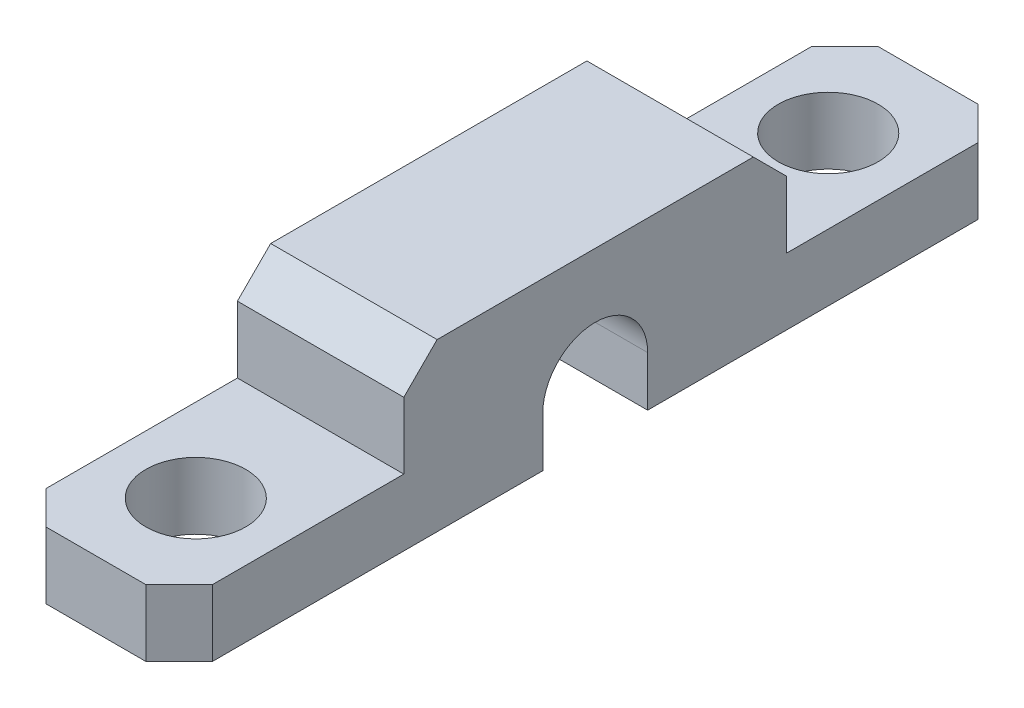
ISO-10303-21;
HEADER;
FILE_DESCRIPTION(('STEP AP214'),'2;1');
FILE_NAME('part.step','',(''),(''),'','','');
FILE_SCHEMA(('AUTOMOTIVE_DESIGN { 1 0 10303 214 1 1 1 1 }'));
ENDSEC;
DATA;
#1=APPLICATION_CONTEXT('core data for automotive mechanical design processes');
#2=APPLICATION_PROTOCOL_DEFINITION('international standard','automotive_design',2000,#1);
#3=PRODUCT_CONTEXT('',#1,'mechanical');
#4=PRODUCT('Part','Part','',(#3));
#5=PRODUCT_RELATED_PRODUCT_CATEGORY('part','',(#4));
#6=PRODUCT_DEFINITION_FORMATION('','',#4);
#7=PRODUCT_DEFINITION_CONTEXT('part definition',#1,'design');
#8=PRODUCT_DEFINITION('design','',#6,#7);
#9=PRODUCT_DEFINITION_SHAPE('','',#8);
#10=(LENGTH_UNIT() NAMED_UNIT(*) SI_UNIT(.MILLI.,.METRE.));
#11=(NAMED_UNIT(*) PLANE_ANGLE_UNIT() SI_UNIT($,.RADIAN.));
#12=(NAMED_UNIT(*) SI_UNIT($,.STERADIAN.) SOLID_ANGLE_UNIT());
#13=UNCERTAINTY_MEASURE_WITH_UNIT(LENGTH_MEASURE(1.E-05),#10,'distance_accuracy_value','');
#14=(GEOMETRIC_REPRESENTATION_CONTEXT(3) GLOBAL_UNCERTAINTY_ASSIGNED_CONTEXT((#13)) GLOBAL_UNIT_ASSIGNED_CONTEXT((#10,
#11,#12)) REPRESENTATION_CONTEXT('',''));
#15=CARTESIAN_POINT('',(0.,0.,0.));
#16=DIRECTION('',(0.,0.,1.));
#17=DIRECTION('',(1.,0.,0.));
#18=AXIS2_PLACEMENT_3D('',#15,#16,#17);
#19=CARTESIAN_POINT('',(10.,0.,0.));
#20=DIRECTION('',(1.,0.,0.));
#21=DIRECTION('',(0.,0.,-1.));
#22=AXIS2_PLACEMENT_3D('',#19,#20,#21);
#23=PLANE('',#22);
#24=DIRECTION('',(0.,1.,0.));
#25=VECTOR('',#24,1.);
#26=CARTESIAN_POINT('',(10.,0.,-11.5));
#27=LINE('',#26,#25);
#28=CARTESIAN_POINT('',(10.,-0.999999999999999,-11.5));
#29=VERTEX_POINT('',#28);
#30=CARTESIAN_POINT('',(10.,3.00000000000001,-11.5));
#31=VERTEX_POINT('',#30);
#32=EDGE_CURVE('E226',#29,#31,#27,.T.);
#33=ORIENTED_EDGE('',*,*,#32,.T.);
#34=DIRECTION('',(0.,0.707106781186548,0.707106781186547));
#35=VECTOR('',#34,1.);
#36=CARTESIAN_POINT('',(10.,7.25,-7.25000000000001));
#37=LINE('',#36,#35);
#38=CARTESIAN_POINT('',(10.,5.,-9.5));
#39=VERTEX_POINT('',#38);
#40=EDGE_CURVE('E296',#31,#39,#37,.T.);
#41=ORIENTED_EDGE('',*,*,#40,.T.);
#42=DIRECTION('',(0.,0.,1.));
#43=VECTOR('',#42,1.);
#44=CARTESIAN_POINT('',(10.,5.,25.));
#45=LINE('',#44,#43);
#46=CARTESIAN_POINT('',(10.,5.,9.50000000000001));
#47=VERTEX_POINT('',#46);
#48=EDGE_CURVE('E241',#39,#47,#45,.T.);
#49=ORIENTED_EDGE('',*,*,#48,.T.);
#50=DIRECTION('',(0.,-0.707106781186548,0.707106781186548));
#51=VECTOR('',#50,1.);
#52=CARTESIAN_POINT('',(10.,7.25000000000001,7.25000000000001));
#53=LINE('',#52,#51);
#54=CARTESIAN_POINT('',(10.,3.00000000000001,11.5));
#55=VERTEX_POINT('',#54);
#56=EDGE_CURVE('E294',#47,#55,#53,.T.);
#57=ORIENTED_EDGE('',*,*,#56,.T.);
#58=DIRECTION('',(0.,-1.,0.));
#59=VECTOR('',#58,1.);
#60=CARTESIAN_POINT('',(10.,0.,11.5));
#61=LINE('',#60,#59);
#62=CARTESIAN_POINT('',(9.99999999999999,-0.999999999999999,11.5));
#63=VERTEX_POINT('',#62);
#64=EDGE_CURVE('E238',#55,#63,#61,.T.);
#65=ORIENTED_EDGE('',*,*,#64,.T.);
#66=DIRECTION('',(0.,0.,1.));
#67=VECTOR('',#66,1.);
#68=CARTESIAN_POINT('',(10.,-0.999999999999999,0.));
#69=LINE('',#68,#67);
#70=CARTESIAN_POINT('',(10.,-0.999999999999999,23.));
#71=VERTEX_POINT('',#70);
#72=EDGE_CURVE('E235',#63,#71,#69,.T.);
#73=ORIENTED_EDGE('',*,*,#72,.T.);
#74=DIRECTION('',(0.,-1.,0.));
#75=VECTOR('',#74,1.);
#76=CARTESIAN_POINT('',(10.,-5.,23.));
#77=LINE('',#76,#75);
#78=CARTESIAN_POINT('',(10.,-5.,23.));
#79=VERTEX_POINT('',#78);
#80=EDGE_CURVE('E291',#71,#79,#77,.T.);
#81=ORIENTED_EDGE('',*,*,#80,.T.);
#82=DIRECTION('',(0.,0.,-1.));
#83=VECTOR('',#82,1.);
#84=CARTESIAN_POINT('',(10.,-5.,25.));
#85=LINE('',#84,#83);
#86=CARTESIAN_POINT('',(10.,-5.,3.15));
#87=VERTEX_POINT('',#86);
#88=EDGE_CURVE('E246',#79,#87,#85,.T.);
#89=ORIENTED_EDGE('',*,*,#88,.T.);
#90=DIRECTION('',(0.,-1.,0.));
#91=VECTOR('',#90,1.);
#92=CARTESIAN_POINT('',(10.,0.,3.15));
#93=LINE('',#92,#91);
#94=CARTESIAN_POINT('',(10.,-2.,3.15));
#95=VERTEX_POINT('',#94);
#96=EDGE_CURVE('E197',#95,#87,#93,.T.);
#97=ORIENTED_EDGE('',*,*,#96,.F.);
#98=CARTESIAN_POINT('',(10.,-2.,0.));
#99=DIRECTION('',(1.,0.,0.));
#100=DIRECTION('',(0.,0.,-1.));
#101=AXIS2_PLACEMENT_3D('',#98,#99,#100);
#102=CIRCLE('',#101,3.15);
#103=CARTESIAN_POINT('',(10.,-2.,-3.15));
#104=VERTEX_POINT('',#103);
#105=EDGE_CURVE('E200',#104,#95,#102,.T.);
#106=ORIENTED_EDGE('',*,*,#105,.F.);
#107=DIRECTION('',(0.,-1.,0.));
#108=VECTOR('',#107,1.);
#109=CARTESIAN_POINT('',(10.,0.,-3.15));
#110=LINE('',#109,#108);
#111=CARTESIAN_POINT('',(10.,-5.,-3.15));
#112=VERTEX_POINT('',#111);
#113=EDGE_CURVE('E179',#104,#112,#110,.T.);
#114=ORIENTED_EDGE('',*,*,#113,.T.);
#115=CARTESIAN_POINT('',(10.,-5.,-23.));
#116=VERTEX_POINT('',#115);
#117=EDGE_CURVE('E244',#112,#116,#85,.T.);
#118=ORIENTED_EDGE('',*,*,#117,.T.);
#119=DIRECTION('',(0.,1.,0.));
#120=VECTOR('',#119,1.);
#121=CARTESIAN_POINT('',(10.,-0.999999999999999,-23.));
#122=LINE('',#121,#120);
#123=CARTESIAN_POINT('',(10.,-0.999999999999999,-23.));
#124=VERTEX_POINT('',#123);
#125=EDGE_CURVE('E288',#116,#124,#122,.T.);
#126=ORIENTED_EDGE('',*,*,#125,.T.);
#127=DIRECTION('',(0.,0.,1.));
#128=VECTOR('',#127,1.);
#129=CARTESIAN_POINT('',(10.,-0.999999999999999,0.));
#130=LINE('',#129,#128);
#131=EDGE_CURVE('E224',#124,#29,#130,.T.);
#132=ORIENTED_EDGE('',*,*,#131,.T.);
#133=EDGE_LOOP('',(#33,#41,#49,#57,#65,#73,#81,#89,#97,#106,#114,#118,#126,#132));
#134=FACE_BOUND('',#133,.T.);
#135=ADVANCED_FACE('F48',(#134),#23,.T.);
#136=CARTESIAN_POINT('',(0.,0.,0.));
#137=DIRECTION('',(1.,0.,0.));
#138=DIRECTION('',(0.,0.,-1.));
#139=AXIS2_PLACEMENT_3D('',#136,#137,#138);
#140=PLANE('',#139);
#141=DIRECTION('',(0.,0.,1.));
#142=VECTOR('',#141,1.);
#143=CARTESIAN_POINT('',(0.,5.,25.));
#144=LINE('',#143,#142);
#145=CARTESIAN_POINT('',(0.,5.,-9.5));
#146=VERTEX_POINT('',#145);
#147=CARTESIAN_POINT('',(0.,5.,9.50000000000001));
#148=VERTEX_POINT('',#147);
#149=EDGE_CURVE('E240',#146,#148,#144,.T.);
#150=ORIENTED_EDGE('',*,*,#149,.F.);
#151=DIRECTION('',(0.,-0.707106781186548,-0.707106781186547));
#152=VECTOR('',#151,1.);
#153=CARTESIAN_POINT('',(0.,5.,-9.5));
#154=LINE('',#153,#152);
#155=CARTESIAN_POINT('',(0.,3.00000000000001,-11.5));
#156=VERTEX_POINT('',#155);
#157=EDGE_CURVE('E284',#146,#156,#154,.T.);
#158=ORIENTED_EDGE('',*,*,#157,.T.);
#159=DIRECTION('',(0.,1.,0.));
#160=VECTOR('',#159,1.);
#161=CARTESIAN_POINT('',(0.,0.,-11.5));
#162=LINE('',#161,#160);
#163=CARTESIAN_POINT('',(0.,-0.999999999999999,-11.5));
#164=VERTEX_POINT('',#163);
#165=EDGE_CURVE('E264',#164,#156,#162,.T.);
#166=ORIENTED_EDGE('',*,*,#165,.F.);
#167=DIRECTION('',(0.,0.,1.));
#168=VECTOR('',#167,1.);
#169=CARTESIAN_POINT('',(0.,-0.999999999999999,0.));
#170=LINE('',#169,#168);
#171=CARTESIAN_POINT('',(0.,-0.999999999999999,-23.));
#172=VERTEX_POINT('',#171);
#173=EDGE_CURVE('E222',#172,#164,#170,.T.);
#174=ORIENTED_EDGE('',*,*,#173,.F.);
#175=DIRECTION('',(0.,-1.,0.));
#176=VECTOR('',#175,1.);
#177=CARTESIAN_POINT('',(0.,0.,-23.));
#178=LINE('',#177,#176);
#179=CARTESIAN_POINT('',(0.,-5.,-23.));
#180=VERTEX_POINT('',#179);
#181=EDGE_CURVE('E278',#172,#180,#178,.T.);
#182=ORIENTED_EDGE('',*,*,#181,.T.);
#183=DIRECTION('',(0.,0.,-1.));
#184=VECTOR('',#183,1.);
#185=CARTESIAN_POINT('',(0.,-5.,25.));
#186=LINE('',#185,#184);
#187=CARTESIAN_POINT('',(0.,-5.,-3.15));
#188=VERTEX_POINT('',#187);
#189=EDGE_CURVE('E196',#188,#180,#186,.T.);
#190=ORIENTED_EDGE('',*,*,#189,.F.);
#191=DIRECTION('',(0.,-1.,0.));
#192=VECTOR('',#191,1.);
#193=CARTESIAN_POINT('',(0.,0.,-3.15));
#194=LINE('',#193,#192);
#195=CARTESIAN_POINT('',(0.,-2.,-3.15));
#196=VERTEX_POINT('',#195);
#197=EDGE_CURVE('E176',#196,#188,#194,.T.);
#198=ORIENTED_EDGE('',*,*,#197,.F.);
#199=CARTESIAN_POINT('',(0.,-2.,0.));
#200=DIRECTION('',(1.,0.,0.));
#201=DIRECTION('',(0.,0.,-1.));
#202=AXIS2_PLACEMENT_3D('',#199,#200,#201);
#203=CIRCLE('',#202,3.15);
#204=CARTESIAN_POINT('',(0.,-2.,3.15));
#205=VERTEX_POINT('',#204);
#206=EDGE_CURVE('E187',#196,#205,#203,.T.);
#207=ORIENTED_EDGE('',*,*,#206,.T.);
#208=DIRECTION('',(0.,-1.,0.));
#209=VECTOR('',#208,1.);
#210=CARTESIAN_POINT('',(0.,0.,3.15));
#211=LINE('',#210,#209);
#212=CARTESIAN_POINT('',(0.,-5.,3.15));
#213=VERTEX_POINT('',#212);
#214=EDGE_CURVE('E184',#205,#213,#211,.T.);
#215=ORIENTED_EDGE('',*,*,#214,.T.);
#216=CARTESIAN_POINT('',(0.,-5.,23.));
#217=VERTEX_POINT('',#216);
#218=EDGE_CURVE('E245',#217,#213,#186,.T.);
#219=ORIENTED_EDGE('',*,*,#218,.F.);
#220=DIRECTION('',(0.,1.,0.));
#221=VECTOR('',#220,1.);
#222=CARTESIAN_POINT('',(0.,0.,23.));
#223=LINE('',#222,#221);
#224=CARTESIAN_POINT('',(0.,-0.999999999999999,23.));
#225=VERTEX_POINT('',#224);
#226=EDGE_CURVE('E280',#217,#225,#223,.T.);
#227=ORIENTED_EDGE('',*,*,#226,.T.);
#228=DIRECTION('',(0.,0.,1.));
#229=VECTOR('',#228,1.);
#230=CARTESIAN_POINT('',(0.,-0.999999999999999,0.));
#231=LINE('',#230,#229);
#232=CARTESIAN_POINT('',(0.,-0.999999999999999,11.5));
#233=VERTEX_POINT('',#232);
#234=EDGE_CURVE('E256',#233,#225,#231,.T.);
#235=ORIENTED_EDGE('',*,*,#234,.F.);
#236=DIRECTION('',(0.,-1.,0.));
#237=VECTOR('',#236,1.);
#238=CARTESIAN_POINT('',(0.,0.,11.5));
#239=LINE('',#238,#237);
#240=CARTESIAN_POINT('',(0.,3.00000000000001,11.5));
#241=VERTEX_POINT('',#240);
#242=EDGE_CURVE('E259',#241,#233,#239,.T.);
#243=ORIENTED_EDGE('',*,*,#242,.F.);
#244=DIRECTION('',(0.,0.707106781186548,-0.707106781186548));
#245=VECTOR('',#244,1.);
#246=CARTESIAN_POINT('',(0.,5.,9.50000000000001));
#247=LINE('',#246,#245);
#248=EDGE_CURVE('E282',#241,#148,#247,.T.);
#249=ORIENTED_EDGE('',*,*,#248,.T.);
#250=EDGE_LOOP('',(#150,#158,#166,#174,#182,#190,#198,#207,#215,#219,#227,#235,#243,#249));
#251=FACE_BOUND('',#250,.T.);
#252=ADVANCED_FACE('F195',(#251),#140,.F.);
#253=CARTESIAN_POINT('',(10.,-5.,25.));
#254=DIRECTION('',(0.,1.,0.));
#255=DIRECTION('',(0.,0.,1.));
#256=AXIS2_PLACEMENT_3D('',#253,#254,#255);
#257=PLANE('',#256);
#258=CARTESIAN_POINT('',(5.,-5.,-19.));
#259=DIRECTION('',(0.,1.,0.));
#260=DIRECTION('',(0.,0.,1.));
#261=AXIS2_PLACEMENT_3D('',#258,#259,#260);
#262=CIRCLE('',#261,3.);
#263=CARTESIAN_POINT('',(5.,-5.,-16.));
#264=VERTEX_POINT('',#263);
#265=EDGE_CURVE('E216',#264,#264,#262,.T.);
#266=ORIENTED_EDGE('',*,*,#265,.T.);
#267=EDGE_LOOP('',(#266));
#268=FACE_BOUND('',#267,.T.);
#269=ORIENTED_EDGE('',*,*,#189,.T.);
#270=DIRECTION('',(-0.707106781186548,0.,0.707106781186548));
#271=VECTOR('',#270,1.);
#272=CARTESIAN_POINT('',(2.,-5.,-25.));
#273=LINE('',#272,#271);
#274=CARTESIAN_POINT('',(2.,-5.,-25.));
#275=VERTEX_POINT('',#274);
#276=EDGE_CURVE('E12',#180,#275,#273,.F.);
#277=ORIENTED_EDGE('',*,*,#276,.T.);
#278=DIRECTION('',(-1.,0.,0.));
#279=VECTOR('',#278,1.);
#280=CARTESIAN_POINT('',(10.,-5.,-25.));
#281=LINE('',#280,#279);
#282=CARTESIAN_POINT('',(8.,-5.,-25.));
#283=VERTEX_POINT('',#282);
#284=EDGE_CURVE('E248',#283,#275,#281,.T.);
#285=ORIENTED_EDGE('',*,*,#284,.F.);
#286=DIRECTION('',(0.707106781186548,0.,0.707106781186548));
#287=VECTOR('',#286,1.);
#288=CARTESIAN_POINT('',(10.,-5.,-23.));
#289=LINE('',#288,#287);
#290=EDGE_CURVE('E56',#283,#116,#289,.T.);
#291=ORIENTED_EDGE('',*,*,#290,.T.);
#292=ORIENTED_EDGE('',*,*,#117,.F.);
#293=DIRECTION('',(1.,0.,0.));
#294=VECTOR('',#293,1.);
#295=CARTESIAN_POINT('',(10.,-5.,-3.15));
#296=LINE('',#295,#294);
#297=EDGE_CURVE('E270',#188,#112,#296,.T.);
#298=ORIENTED_EDGE('',*,*,#297,.F.);
#299=EDGE_LOOP('',(#269,#277,#285,#291,#292,#298));
#300=FACE_BOUND('',#299,.T.);
#301=ADVANCED_FACE('F323',(#268,#300),#257,.F.);
#302=CARTESIAN_POINT('',(5.,-5.,19.));
#303=DIRECTION('',(0.,1.,0.));
#304=DIRECTION('',(0.,0.,1.));
#305=AXIS2_PLACEMENT_3D('',#302,#303,#304);
#306=CIRCLE('',#305,3.);
#307=CARTESIAN_POINT('',(5.,-5.,22.));
#308=VERTEX_POINT('',#307);
#309=EDGE_CURVE('E210',#308,#308,#306,.T.);
#310=ORIENTED_EDGE('',*,*,#309,.T.);
#311=EDGE_LOOP('',(#310));
#312=FACE_BOUND('',#311,.T.);
#313=DIRECTION('',(-1.,0.,0.));
#314=VECTOR('',#313,1.);
#315=CARTESIAN_POINT('',(10.,-5.,25.));
#316=LINE('',#315,#314);
#317=CARTESIAN_POINT('',(8.,-5.,25.));
#318=VERTEX_POINT('',#317);
#319=CARTESIAN_POINT('',(2.,-5.,25.));
#320=VERTEX_POINT('',#319);
#321=EDGE_CURVE('E253',#318,#320,#316,.T.);
#322=ORIENTED_EDGE('',*,*,#321,.T.);
#323=DIRECTION('',(0.707106781186548,0.,0.707106781186548));
#324=VECTOR('',#323,1.);
#325=CARTESIAN_POINT('',(2.,-5.,25.));
#326=LINE('',#325,#324);
#327=EDGE_CURVE('E307',#320,#217,#326,.F.);
#328=ORIENTED_EDGE('',*,*,#327,.T.);
#329=ORIENTED_EDGE('',*,*,#218,.T.);
#330=DIRECTION('',(1.,0.,0.));
#331=VECTOR('',#330,1.);
#332=CARTESIAN_POINT('',(10.,-5.,3.15));
#333=LINE('',#332,#331);
#334=EDGE_CURVE('E267',#213,#87,#333,.T.);
#335=ORIENTED_EDGE('',*,*,#334,.T.);
#336=ORIENTED_EDGE('',*,*,#88,.F.);
#337=DIRECTION('',(-0.707106781186548,0.,0.707106781186548));
#338=VECTOR('',#337,1.);
#339=CARTESIAN_POINT('',(10.,-5.,23.));
#340=LINE('',#339,#338);
#341=EDGE_CURVE('E305',#79,#318,#340,.T.);
#342=ORIENTED_EDGE('',*,*,#341,.T.);
#343=EDGE_LOOP('',(#322,#328,#329,#335,#336,#342));
#344=FACE_BOUND('',#343,.T.);
#345=ADVANCED_FACE('F381',(#312,#344),#257,.F.);
#346=CARTESIAN_POINT('',(10.,5.,25.));
#347=DIRECTION('',(0.,-1.,0.));
#348=DIRECTION('',(0.,0.,-1.));
#349=AXIS2_PLACEMENT_3D('',#346,#347,#348);
#350=PLANE('',#349);
#351=ORIENTED_EDGE('',*,*,#48,.F.);
#352=DIRECTION('',(-1.,0.,0.));
#353=VECTOR('',#352,1.);
#354=CARTESIAN_POINT('',(0.,5.,-9.5));
#355=LINE('',#354,#353);
#356=EDGE_CURVE('E275',#39,#146,#355,.T.);
#357=ORIENTED_EDGE('',*,*,#356,.T.);
#358=ORIENTED_EDGE('',*,*,#149,.T.);
#359=DIRECTION('',(1.,0.,0.));
#360=VECTOR('',#359,1.);
#361=CARTESIAN_POINT('',(9.99999999999999,5.,9.50000000000001));
#362=LINE('',#361,#360);
#363=EDGE_CURVE('E272',#148,#47,#362,.T.);
#364=ORIENTED_EDGE('',*,*,#363,.T.);
#365=EDGE_LOOP('',(#351,#357,#358,#364));
#366=FACE_BOUND('',#365,.T.);
#367=ADVANCED_FACE('F348',(#366),#350,.F.);
#368=CARTESIAN_POINT('',(10.,5.,-25.));
#369=DIRECTION('',(0.,0.,1.));
#370=DIRECTION('',(1.,0.,0.));
#371=AXIS2_PLACEMENT_3D('',#368,#369,#370);
#372=PLANE('',#371);
#373=ORIENTED_EDGE('',*,*,#284,.T.);
#374=DIRECTION('',(0.,1.,0.));
#375=VECTOR('',#374,1.);
#376=CARTESIAN_POINT('',(2.,5.,-25.));
#377=LINE('',#376,#375);
#378=CARTESIAN_POINT('',(2.,-0.999999999999999,-25.));
#379=VERTEX_POINT('',#378);
#380=EDGE_CURVE('E314',#275,#379,#377,.T.);
#381=ORIENTED_EDGE('',*,*,#380,.T.);
#382=DIRECTION('',(-1.,0.,0.));
#383=VECTOR('',#382,1.);
#384=CARTESIAN_POINT('',(10.,-0.999999999999999,-25.));
#385=LINE('',#384,#383);
#386=CARTESIAN_POINT('',(8.,-0.999999999999999,-25.));
#387=VERTEX_POINT('',#386);
#388=EDGE_CURVE('E261',#387,#379,#385,.T.);
#389=ORIENTED_EDGE('',*,*,#388,.F.);
#390=DIRECTION('',(0.,-1.,0.));
#391=VECTOR('',#390,1.);
#392=CARTESIAN_POINT('',(8.,-5.,-25.));
#393=LINE('',#392,#391);
#394=EDGE_CURVE('E68',#387,#283,#393,.T.);
#395=ORIENTED_EDGE('',*,*,#394,.T.);
#396=EDGE_LOOP('',(#373,#381,#389,#395));
#397=FACE_BOUND('',#396,.T.);
#398=ADVANCED_FACE('F331',(#397),#372,.F.);
#399=CARTESIAN_POINT('',(10.,5.,25.));
#400=DIRECTION('',(0.,0.,-1.));
#401=DIRECTION('',(-1.,0.,0.));
#402=AXIS2_PLACEMENT_3D('',#399,#400,#401);
#403=PLANE('',#402);
#404=DIRECTION('',(1.,0.,0.));
#405=VECTOR('',#404,1.);
#406=CARTESIAN_POINT('',(10.,-0.999999999999999,25.));
#407=LINE('',#406,#405);
#408=CARTESIAN_POINT('',(2.,-0.999999999999999,25.));
#409=VERTEX_POINT('',#408);
#410=CARTESIAN_POINT('',(8.,-0.999999999999999,25.));
#411=VERTEX_POINT('',#410);
#412=EDGE_CURVE('E232',#409,#411,#407,.T.);
#413=ORIENTED_EDGE('',*,*,#412,.F.);
#414=DIRECTION('',(0.,-1.,0.));
#415=VECTOR('',#414,1.);
#416=CARTESIAN_POINT('',(2.,5.,25.));
#417=LINE('',#416,#415);
#418=EDGE_CURVE('E302',#409,#320,#417,.T.);
#419=ORIENTED_EDGE('',*,*,#418,.T.);
#420=ORIENTED_EDGE('',*,*,#321,.F.);
#421=DIRECTION('',(0.,1.,0.));
#422=VECTOR('',#421,1.);
#423=CARTESIAN_POINT('',(8.,-0.999999999999999,25.));
#424=LINE('',#423,#422);
#425=EDGE_CURVE('E300',#318,#411,#424,.T.);
#426=ORIENTED_EDGE('',*,*,#425,.T.);
#427=EDGE_LOOP('',(#413,#419,#420,#426));
#428=FACE_BOUND('',#427,.T.);
#429=ADVANCED_FACE('F372',(#428),#403,.F.);
#430=CARTESIAN_POINT('',(-7.06508086529912,-0.999999999999999,11.5));
#431=DIRECTION('',(0.,0.,1.));
#432=DIRECTION('',(1.,0.,0.));
#433=AXIS2_PLACEMENT_3D('',#430,#431,#432);
#434=PLANE('',#433);
#435=ORIENTED_EDGE('',*,*,#64,.F.);
#436=DIRECTION('',(-1.,0.,0.));
#437=VECTOR('',#436,1.);
#438=CARTESIAN_POINT('',(0.,3.00000000000001,11.5));
#439=LINE('',#438,#437);
#440=EDGE_CURVE('E298',#55,#241,#439,.T.);
#441=ORIENTED_EDGE('',*,*,#440,.T.);
#442=ORIENTED_EDGE('',*,*,#242,.T.);
#443=DIRECTION('',(1.,0.,0.));
#444=VECTOR('',#443,1.);
#445=CARTESIAN_POINT('',(-7.06508086529912,-0.999999999999999,11.5));
#446=LINE('',#445,#444);
#447=EDGE_CURVE('E229',#233,#63,#446,.T.);
#448=ORIENTED_EDGE('',*,*,#447,.T.);
#449=EDGE_LOOP('',(#435,#441,#442,#448));
#450=FACE_BOUND('',#449,.T.);
#451=ADVANCED_FACE('F357',(#450),#434,.T.);
#452=CARTESIAN_POINT('',(0.,-0.999999999999999,0.));
#453=DIRECTION('',(0.,1.,0.));
#454=DIRECTION('',(0.,0.,1.));
#455=AXIS2_PLACEMENT_3D('',#452,#453,#454);
#456=PLANE('',#455);
#457=CARTESIAN_POINT('',(5.,-0.999999999999999,19.));
#458=DIRECTION('',(0.,1.,0.));
#459=DIRECTION('',(0.,0.,1.));
#460=AXIS2_PLACEMENT_3D('',#457,#458,#459);
#461=CIRCLE('',#460,3.);
#462=CARTESIAN_POINT('',(5.,-0.999999999999999,22.));
#463=VERTEX_POINT('',#462);
#464=EDGE_CURVE('E206',#463,#463,#461,.T.);
#465=ORIENTED_EDGE('',*,*,#464,.F.);
#466=EDGE_LOOP('',(#465));
#467=FACE_BOUND('',#466,.T.);
#468=ORIENTED_EDGE('',*,*,#234,.T.);
#469=DIRECTION('',(-0.707106781186548,0.,-0.707106781186548));
#470=VECTOR('',#469,1.);
#471=CARTESIAN_POINT('',(-11.5,-0.999999999999999,11.5));
#472=LINE('',#471,#470);
#473=EDGE_CURVE('E311',#225,#409,#472,.F.);
#474=ORIENTED_EDGE('',*,*,#473,.T.);
#475=ORIENTED_EDGE('',*,*,#412,.T.);
#476=DIRECTION('',(0.707106781186548,0.,-0.707106781186548));
#477=VECTOR('',#476,1.);
#478=CARTESIAN_POINT('',(16.5,-0.999999999999999,16.5));
#479=LINE('',#478,#477);
#480=EDGE_CURVE('E309',#411,#71,#479,.T.);
#481=ORIENTED_EDGE('',*,*,#480,.T.);
#482=ORIENTED_EDGE('',*,*,#72,.F.);
#483=ORIENTED_EDGE('',*,*,#447,.F.);
#484=EDGE_LOOP('',(#468,#474,#475,#481,#482,#483));
#485=FACE_BOUND('',#484,.T.);
#486=ADVANCED_FACE('F362',(#467,#485),#456,.T.);
#487=CARTESIAN_POINT('',(23.7364835875466,-0.999999999999999,-11.5));
#488=DIRECTION('',(0.,0.,-1.));
#489=DIRECTION('',(-1.,0.,0.));
#490=AXIS2_PLACEMENT_3D('',#487,#488,#489);
#491=PLANE('',#490);
#492=ORIENTED_EDGE('',*,*,#165,.T.);
#493=DIRECTION('',(1.,0.,0.));
#494=VECTOR('',#493,1.);
#495=CARTESIAN_POINT('',(10.,3.00000000000001,-11.5));
#496=LINE('',#495,#494);
#497=EDGE_CURVE('E286',#156,#31,#496,.T.);
#498=ORIENTED_EDGE('',*,*,#497,.T.);
#499=ORIENTED_EDGE('',*,*,#32,.F.);
#500=DIRECTION('',(-1.,0.,0.));
#501=VECTOR('',#500,1.);
#502=CARTESIAN_POINT('',(23.7364835875466,-0.999999999999999,-11.5));
#503=LINE('',#502,#501);
#504=EDGE_CURVE('E219',#29,#164,#503,.T.);
#505=ORIENTED_EDGE('',*,*,#504,.T.);
#506=EDGE_LOOP('',(#492,#498,#499,#505));
#507=FACE_BOUND('',#506,.T.);
#508=ADVANCED_FACE('F340',(#507),#491,.T.);
#509=CARTESIAN_POINT('',(0.,-0.999999999999999,0.));
#510=DIRECTION('',(0.,1.,0.));
#511=DIRECTION('',(0.,0.,1.));
#512=AXIS2_PLACEMENT_3D('',#509,#510,#511);
#513=PLANE('',#512);
#514=CARTESIAN_POINT('',(5.,-0.999999999999999,-19.));
#515=DIRECTION('',(0.,1.,0.));
#516=DIRECTION('',(0.,0.,1.));
#517=AXIS2_PLACEMENT_3D('',#514,#515,#516);
#518=CIRCLE('',#517,3.);
#519=CARTESIAN_POINT('',(5.,-0.999999999999999,-16.));
#520=VERTEX_POINT('',#519);
#521=EDGE_CURVE('E213',#520,#520,#518,.T.);
#522=ORIENTED_EDGE('',*,*,#521,.F.);
#523=EDGE_LOOP('',(#522));
#524=FACE_BOUND('',#523,.T.);
#525=ORIENTED_EDGE('',*,*,#388,.T.);
#526=DIRECTION('',(0.707106781186548,0.,-0.707106781186548));
#527=VECTOR('',#526,1.);
#528=CARTESIAN_POINT('',(-11.5,-0.999999999999999,-11.5));
#529=LINE('',#528,#527);
#530=EDGE_CURVE('E319',#379,#172,#529,.F.);
#531=ORIENTED_EDGE('',*,*,#530,.T.);
#532=ORIENTED_EDGE('',*,*,#173,.T.);
#533=ORIENTED_EDGE('',*,*,#504,.F.);
#534=ORIENTED_EDGE('',*,*,#131,.F.);
#535=DIRECTION('',(-0.707106781186548,0.,-0.707106781186548));
#536=VECTOR('',#535,1.);
#537=CARTESIAN_POINT('',(16.5,-0.999999999999999,-16.5));
#538=LINE('',#537,#536);
#539=EDGE_CURVE('E317',#124,#387,#538,.T.);
#540=ORIENTED_EDGE('',*,*,#539,.T.);
#541=EDGE_LOOP('',(#525,#531,#532,#533,#534,#540));
#542=FACE_BOUND('',#541,.T.);
#543=ADVANCED_FACE('F329',(#524,#542),#513,.T.);
#544=CARTESIAN_POINT('',(5.,-7.,-19.));
#545=DIRECTION('',(0.,1.,0.));
#546=DIRECTION('',(0.,0.,1.));
#547=AXIS2_PLACEMENT_3D('',#544,#545,#546);
#548=CYLINDRICAL_SURFACE('',#547,3.);
#549=ORIENTED_EDGE('',*,*,#521,.T.);
#550=EDGE_LOOP('',(#549));
#551=FACE_BOUND('',#550,.T.);
#552=ORIENTED_EDGE('',*,*,#265,.F.);
#553=EDGE_LOOP('',(#552));
#554=FACE_BOUND('',#553,.T.);
#555=ADVANCED_FACE('F463',(#551,#554),#548,.F.);
#556=CARTESIAN_POINT('',(5.,-7.,19.));
#557=DIRECTION('',(0.,1.,0.));
#558=DIRECTION('',(0.,0.,1.));
#559=AXIS2_PLACEMENT_3D('',#556,#557,#558);
#560=CYLINDRICAL_SURFACE('',#559,3.);
#561=ORIENTED_EDGE('',*,*,#464,.T.);
#562=EDGE_LOOP('',(#561));
#563=FACE_BOUND('',#562,.T.);
#564=ORIENTED_EDGE('',*,*,#309,.F.);
#565=EDGE_LOOP('',(#564));
#566=FACE_BOUND('',#565,.T.);
#567=ADVANCED_FACE('F392',(#563,#566),#560,.F.);
#568=CARTESIAN_POINT('',(0.,0.,-3.15));
#569=DIRECTION('',(0.,0.,1.));
#570=DIRECTION('',(0.,-1.,0.));
#571=AXIS2_PLACEMENT_3D('',#568,#569,#570);
#572=PLANE('',#571);
#573=ORIENTED_EDGE('',*,*,#297,.T.);
#574=ORIENTED_EDGE('',*,*,#113,.F.);
#575=DIRECTION('',(1.,0.,0.));
#576=VECTOR('',#575,1.);
#577=CARTESIAN_POINT('',(0.,-2.,-3.15));
#578=LINE('',#577,#576);
#579=EDGE_CURVE('E172',#196,#104,#578,.T.);
#580=ORIENTED_EDGE('',*,*,#579,.F.);
#581=ORIENTED_EDGE('',*,*,#197,.T.);
#582=EDGE_LOOP('',(#573,#574,#580,#581));
#583=FACE_BOUND('',#582,.T.);
#584=ADVANCED_FACE('F174',(#583),#572,.T.);
#585=CARTESIAN_POINT('',(0.,0.,3.15));
#586=DIRECTION('',(0.,0.,1.));
#587=DIRECTION('',(0.,-1.,0.));
#588=AXIS2_PLACEMENT_3D('',#585,#586,#587);
#589=PLANE('',#588);
#590=ORIENTED_EDGE('',*,*,#214,.F.);
#591=DIRECTION('',(1.,0.,0.));
#592=VECTOR('',#591,1.);
#593=CARTESIAN_POINT('',(0.,-2.,3.15));
#594=LINE('',#593,#592);
#595=EDGE_CURVE('E183',#205,#95,#594,.T.);
#596=ORIENTED_EDGE('',*,*,#595,.T.);
#597=ORIENTED_EDGE('',*,*,#96,.T.);
#598=ORIENTED_EDGE('',*,*,#334,.F.);
#599=EDGE_LOOP('',(#590,#596,#597,#598));
#600=FACE_BOUND('',#599,.T.);
#601=ADVANCED_FACE('F384',(#600),#589,.F.);
#602=CARTESIAN_POINT('',(0.,-2.,0.));
#603=DIRECTION('',(1.,0.,0.));
#604=DIRECTION('',(0.,0.,-1.));
#605=AXIS2_PLACEMENT_3D('',#602,#603,#604);
#606=CYLINDRICAL_SURFACE('',#605,3.15);
#607=ORIENTED_EDGE('',*,*,#105,.T.);
#608=ORIENTED_EDGE('',*,*,#595,.F.);
#609=ORIENTED_EDGE('',*,*,#206,.F.);
#610=ORIENTED_EDGE('',*,*,#579,.T.);
#611=EDGE_LOOP('',(#607,#608,#609,#610));
#612=FACE_BOUND('',#611,.T.);
#613=ADVANCED_FACE('F188',(#612),#606,.F.);
#614=CARTESIAN_POINT('',(10.,5.,-9.5));
#615=DIRECTION('',(0.,0.707106781186547,-0.707106781186548));
#616=DIRECTION('',(1.,0.,0.));
#617=AXIS2_PLACEMENT_3D('',#614,#615,#616);
#618=PLANE('',#617);
#619=ORIENTED_EDGE('',*,*,#40,.F.);
#620=ORIENTED_EDGE('',*,*,#497,.F.);
#621=ORIENTED_EDGE('',*,*,#157,.F.);
#622=ORIENTED_EDGE('',*,*,#356,.F.);
#623=EDGE_LOOP('',(#619,#620,#621,#622));
#624=FACE_BOUND('',#623,.T.);
#625=ADVANCED_FACE('F344',(#624),#618,.T.);
#626=CARTESIAN_POINT('',(10.,5.,9.50000000000001));
#627=DIRECTION('',(0.,0.707106781186548,0.707106781186548));
#628=DIRECTION('',(-1.,0.,0.));
#629=AXIS2_PLACEMENT_3D('',#626,#627,#628);
#630=PLANE('',#629);
#631=ORIENTED_EDGE('',*,*,#248,.F.);
#632=ORIENTED_EDGE('',*,*,#440,.F.);
#633=ORIENTED_EDGE('',*,*,#56,.F.);
#634=ORIENTED_EDGE('',*,*,#363,.F.);
#635=EDGE_LOOP('',(#631,#632,#633,#634));
#636=FACE_BOUND('',#635,.T.);
#637=ADVANCED_FACE('F352',(#636),#630,.T.);
#638=CARTESIAN_POINT('',(2.,5.,25.));
#639=DIRECTION('',(0.707106781186547,0.,-0.707106781186547));
#640=DIRECTION('',(0.,-1.,0.));
#641=AXIS2_PLACEMENT_3D('',#638,#639,#640);
#642=PLANE('',#641);
#643=ORIENTED_EDGE('',*,*,#473,.F.);
#644=ORIENTED_EDGE('',*,*,#226,.F.);
#645=ORIENTED_EDGE('',*,*,#327,.F.);
#646=ORIENTED_EDGE('',*,*,#418,.F.);
#647=EDGE_LOOP('',(#643,#644,#645,#646));
#648=FACE_BOUND('',#647,.T.);
#649=ADVANCED_FACE('F367',(#648),#642,.F.);
#650=CARTESIAN_POINT('',(10.,0.,23.));
#651=DIRECTION('',(0.707106781186547,0.,0.707106781186547));
#652=DIRECTION('',(0.,1.,0.));
#653=AXIS2_PLACEMENT_3D('',#650,#651,#652);
#654=PLANE('',#653);
#655=ORIENTED_EDGE('',*,*,#480,.F.);
#656=ORIENTED_EDGE('',*,*,#425,.F.);
#657=ORIENTED_EDGE('',*,*,#341,.F.);
#658=ORIENTED_EDGE('',*,*,#80,.F.);
#659=EDGE_LOOP('',(#655,#656,#657,#658));
#660=FACE_BOUND('',#659,.T.);
#661=ADVANCED_FACE('F376',(#660),#654,.T.);
#662=CARTESIAN_POINT('',(2.,5.,-25.));
#663=DIRECTION('',(0.707106781186547,0.,0.707106781186547));
#664=DIRECTION('',(0.,1.,0.));
#665=AXIS2_PLACEMENT_3D('',#662,#663,#664);
#666=PLANE('',#665);
#667=ORIENTED_EDGE('',*,*,#276,.F.);
#668=ORIENTED_EDGE('',*,*,#181,.F.);
#669=ORIENTED_EDGE('',*,*,#530,.F.);
#670=ORIENTED_EDGE('',*,*,#380,.F.);
#671=EDGE_LOOP('',(#667,#668,#669,#670));
#672=FACE_BOUND('',#671,.T.);
#673=ADVANCED_FACE('F334',(#672),#666,.F.);
#674=CARTESIAN_POINT('',(10.,0.,-23.));
#675=DIRECTION('',(0.707106781186547,0.,-0.707106781186547));
#676=DIRECTION('',(0.,-1.,0.));
#677=AXIS2_PLACEMENT_3D('',#674,#675,#676);
#678=PLANE('',#677);
#679=ORIENTED_EDGE('',*,*,#290,.F.);
#680=ORIENTED_EDGE('',*,*,#394,.F.);
#681=ORIENTED_EDGE('',*,*,#539,.F.);
#682=ORIENTED_EDGE('',*,*,#125,.F.);
#683=EDGE_LOOP('',(#679,#680,#681,#682));
#684=FACE_BOUND('',#683,.T.);
#685=ADVANCED_FACE('F50',(#684),#678,.T.);
#686=CLOSED_SHELL('',(#135,#252,#301,#345,#367,#398,#429,#451,#486,#508,#543,#555,#567,#584,
#601,#613,#625,#637,#649,#661,#673,#685));
#687=MANIFOLD_SOLID_BREP('B2',#686);
#688=ADVANCED_BREP_SHAPE_REPRESENTATION('',(#18,#687),#14);
#689=SHAPE_DEFINITION_REPRESENTATION(#9,#688);
ENDSEC;
END-ISO-10303-21;
